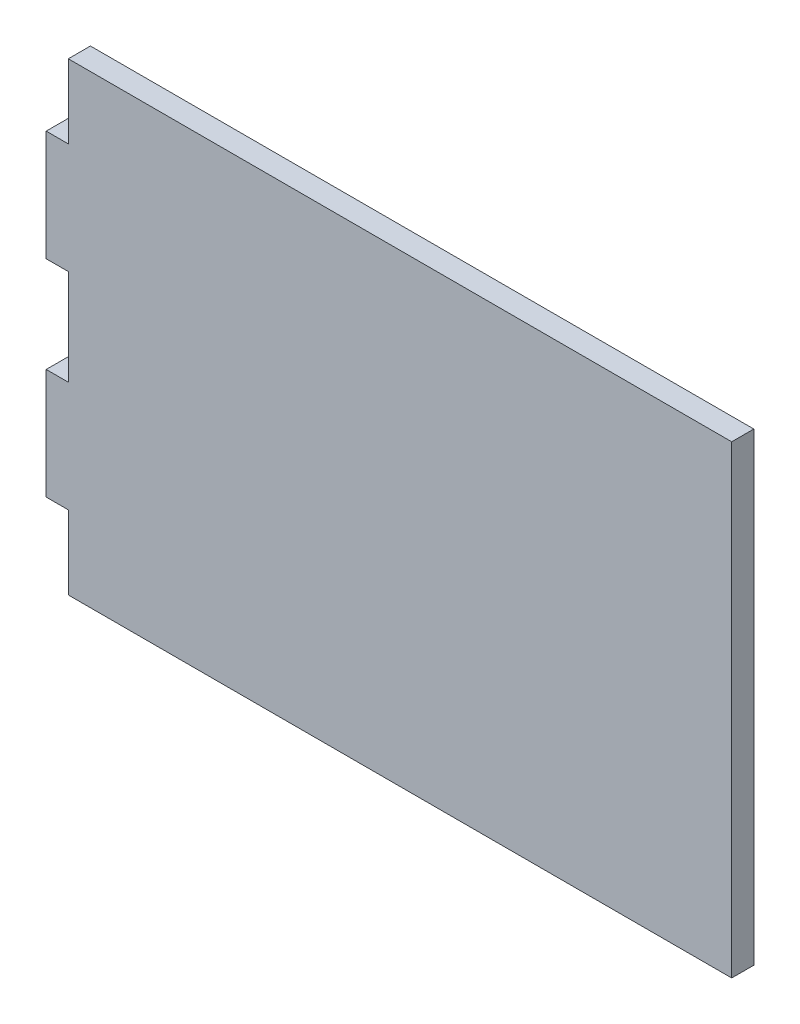
ISO-10303-21;
HEADER;
FILE_DESCRIPTION(('STEP AP214'),'2;1');
FILE_NAME('part.step','',(''),(''),'','','');
FILE_SCHEMA(('AUTOMOTIVE_DESIGN { 1 0 10303 214 1 1 1 1 }'));
ENDSEC;
DATA;
#1=APPLICATION_CONTEXT('core data for automotive mechanical design processes');
#2=APPLICATION_PROTOCOL_DEFINITION('international standard','automotive_design',2000,#1);
#3=PRODUCT_CONTEXT('',#1,'mechanical');
#4=PRODUCT('Part','Part','',(#3));
#5=PRODUCT_RELATED_PRODUCT_CATEGORY('part','',(#4));
#6=PRODUCT_DEFINITION_FORMATION('','',#4);
#7=PRODUCT_DEFINITION_CONTEXT('part definition',#1,'design');
#8=PRODUCT_DEFINITION('design','',#6,#7);
#9=PRODUCT_DEFINITION_SHAPE('','',#8);
#10=(LENGTH_UNIT() NAMED_UNIT(*) SI_UNIT(.MILLI.,.METRE.));
#11=(NAMED_UNIT(*) PLANE_ANGLE_UNIT() SI_UNIT($,.RADIAN.));
#12=(NAMED_UNIT(*) SI_UNIT($,.STERADIAN.) SOLID_ANGLE_UNIT());
#13=UNCERTAINTY_MEASURE_WITH_UNIT(LENGTH_MEASURE(1.E-05),#10,'distance_accuracy_value','');
#14=(GEOMETRIC_REPRESENTATION_CONTEXT(3) GLOBAL_UNCERTAINTY_ASSIGNED_CONTEXT((#13)) GLOBAL_UNIT_ASSIGNED_CONTEXT((#10,
#11,#12)) REPRESENTATION_CONTEXT('',''));
#15=CARTESIAN_POINT('',(0.,0.,0.));
#16=DIRECTION('',(0.,0.,1.));
#17=DIRECTION('',(1.,0.,0.));
#18=AXIS2_PLACEMENT_3D('',#15,#16,#17);
#19=CARTESIAN_POINT('',(0.,-31.5,1.5));
#20=DIRECTION('',(0.,1.,0.));
#21=DIRECTION('',(-1.,0.,0.));
#22=AXIS2_PLACEMENT_3D('',#19,#20,#21);
#23=PLANE('',#22);
#24=DIRECTION('',(1.,0.,0.));
#25=VECTOR('',#24,1.);
#26=CARTESIAN_POINT('',(0.,-31.5,-1.5));
#27=LINE('',#26,#25);
#28=CARTESIAN_POINT('',(-45.,-31.5,-1.5));
#29=VERTEX_POINT('',#28);
#30=CARTESIAN_POINT('',(45.,-31.5,-1.5));
#31=VERTEX_POINT('',#30);
#32=EDGE_CURVE('E159',#29,#31,#27,.T.);
#33=ORIENTED_EDGE('',*,*,#32,.T.);
#34=DIRECTION('',(0.,0.,-1.));
#35=VECTOR('',#34,1.);
#36=CARTESIAN_POINT('',(45.,-31.5,1.5));
#37=LINE('',#36,#35);
#38=CARTESIAN_POINT('',(45.,-31.5,1.5));
#39=VERTEX_POINT('',#38);
#40=EDGE_CURVE('E12',#39,#31,#37,.T.);
#41=ORIENTED_EDGE('',*,*,#40,.F.);
#42=DIRECTION('',(1.,0.,0.));
#43=VECTOR('',#42,1.);
#44=CARTESIAN_POINT('',(0.,-31.5,1.5));
#45=LINE('',#44,#43);
#46=CARTESIAN_POINT('',(-45.,-31.5,1.5));
#47=VERTEX_POINT('',#46);
#48=EDGE_CURVE('E193',#47,#39,#45,.T.);
#49=ORIENTED_EDGE('',*,*,#48,.F.);
#50=DIRECTION('',(0.,0.,-1.));
#51=VECTOR('',#50,1.);
#52=CARTESIAN_POINT('',(-45.,-31.5,1.5));
#53=LINE('',#52,#51);
#54=EDGE_CURVE('E51',#47,#29,#53,.T.);
#55=ORIENTED_EDGE('',*,*,#54,.T.);
#56=EDGE_LOOP('',(#33,#41,#49,#55));
#57=FACE_BOUND('',#56,.T.);
#58=ADVANCED_FACE('F35',(#57),#23,.F.);
#59=CARTESIAN_POINT('',(45.,0.,1.5));
#60=DIRECTION('',(-1.,0.,0.));
#61=DIRECTION('',(0.,0.,1.));
#62=AXIS2_PLACEMENT_3D('',#59,#60,#61);
#63=PLANE('',#62);
#64=DIRECTION('',(0.,1.,0.));
#65=VECTOR('',#64,1.);
#66=CARTESIAN_POINT('',(45.,0.,-1.5));
#67=LINE('',#66,#65);
#68=CARTESIAN_POINT('',(45.,31.5,-1.5));
#69=VERTEX_POINT('',#68);
#70=EDGE_CURVE('E216',#31,#69,#67,.T.);
#71=ORIENTED_EDGE('',*,*,#70,.T.);
#72=DIRECTION('',(0.,0.,-1.));
#73=VECTOR('',#72,1.);
#74=CARTESIAN_POINT('',(45.,31.5,1.5));
#75=LINE('',#74,#73);
#76=CARTESIAN_POINT('',(45.,31.5,1.5));
#77=VERTEX_POINT('',#76);
#78=EDGE_CURVE('E43',#77,#69,#75,.T.);
#79=ORIENTED_EDGE('',*,*,#78,.F.);
#80=DIRECTION('',(0.,1.,0.));
#81=VECTOR('',#80,1.);
#82=CARTESIAN_POINT('',(45.,0.,1.5));
#83=LINE('',#82,#81);
#84=EDGE_CURVE('E101',#39,#77,#83,.T.);
#85=ORIENTED_EDGE('',*,*,#84,.F.);
#86=ORIENTED_EDGE('',*,*,#40,.T.);
#87=EDGE_LOOP('',(#71,#79,#85,#86));
#88=FACE_BOUND('',#87,.T.);
#89=ADVANCED_FACE('F241',(#88),#63,.F.);
#90=CARTESIAN_POINT('',(0.,31.5,1.5));
#91=DIRECTION('',(0.,1.,0.));
#92=DIRECTION('',(-1.,0.,0.));
#93=AXIS2_PLACEMENT_3D('',#90,#91,#92);
#94=PLANE('',#93);
#95=DIRECTION('',(1.,0.,0.));
#96=VECTOR('',#95,1.);
#97=CARTESIAN_POINT('',(0.,31.5,-1.5));
#98=LINE('',#97,#96);
#99=CARTESIAN_POINT('',(-45.,31.5,-1.5));
#100=VERTEX_POINT('',#99);
#101=EDGE_CURVE('E211',#100,#69,#98,.T.);
#102=ORIENTED_EDGE('',*,*,#101,.F.);
#103=DIRECTION('',(0.,0.,-1.));
#104=VECTOR('',#103,1.);
#105=CARTESIAN_POINT('',(-45.,31.5,1.5));
#106=LINE('',#105,#104);
#107=CARTESIAN_POINT('',(-45.,31.5,1.5));
#108=VERTEX_POINT('',#107);
#109=EDGE_CURVE('E395',#108,#100,#106,.T.);
#110=ORIENTED_EDGE('',*,*,#109,.F.);
#111=DIRECTION('',(1.,0.,0.));
#112=VECTOR('',#111,1.);
#113=CARTESIAN_POINT('',(0.,31.5,1.5));
#114=LINE('',#113,#112);
#115=EDGE_CURVE('E183',#108,#77,#114,.T.);
#116=ORIENTED_EDGE('',*,*,#115,.T.);
#117=ORIENTED_EDGE('',*,*,#78,.T.);
#118=EDGE_LOOP('',(#102,#110,#116,#117));
#119=FACE_BOUND('',#118,.T.);
#120=ADVANCED_FACE('F234',(#119),#94,.T.);
#121=CARTESIAN_POINT('',(-45.,0.,1.5));
#122=DIRECTION('',(-1.,0.,0.));
#123=DIRECTION('',(0.,0.,1.));
#124=AXIS2_PLACEMENT_3D('',#121,#122,#123);
#125=PLANE('',#124);
#126=DIRECTION('',(0.,1.,0.));
#127=VECTOR('',#126,1.);
#128=CARTESIAN_POINT('',(-45.,0.,-1.5));
#129=LINE('',#128,#127);
#130=CARTESIAN_POINT('',(-45.,21.5,-1.5));
#131=VERTEX_POINT('',#130);
#132=EDGE_CURVE('E201',#131,#100,#129,.T.);
#133=ORIENTED_EDGE('',*,*,#132,.F.);
#134=DIRECTION('',(0.,0.,-1.));
#135=VECTOR('',#134,1.);
#136=CARTESIAN_POINT('',(-45.,21.5,1.5));
#137=LINE('',#136,#135);
#138=CARTESIAN_POINT('',(-45.,21.5,1.5));
#139=VERTEX_POINT('',#138);
#140=EDGE_CURVE('E393',#139,#131,#137,.T.);
#141=ORIENTED_EDGE('',*,*,#140,.F.);
#142=DIRECTION('',(0.,1.,0.));
#143=VECTOR('',#142,1.);
#144=CARTESIAN_POINT('',(-45.,0.,1.5));
#145=LINE('',#144,#143);
#146=EDGE_CURVE('E154',#139,#108,#145,.T.);
#147=ORIENTED_EDGE('',*,*,#146,.T.);
#148=ORIENTED_EDGE('',*,*,#109,.T.);
#149=EDGE_LOOP('',(#133,#141,#147,#148));
#150=FACE_BOUND('',#149,.T.);
#151=ADVANCED_FACE('F223',(#150),#125,.T.);
#152=CARTESIAN_POINT('',(0.,21.5000000000001,1.5));
#153=DIRECTION('',(0.,-1.,0.));
#154=DIRECTION('',(1.,0.,0.));
#155=AXIS2_PLACEMENT_3D('',#152,#153,#154);
#156=PLANE('',#155);
#157=DIRECTION('',(-1.,0.,0.));
#158=VECTOR('',#157,1.);
#159=CARTESIAN_POINT('',(0.,21.5000000000001,-1.5));
#160=LINE('',#159,#158);
#161=CARTESIAN_POINT('',(-48.,21.5,-1.5));
#162=VERTEX_POINT('',#161);
#163=EDGE_CURVE('E210',#131,#162,#160,.T.);
#164=ORIENTED_EDGE('',*,*,#163,.T.);
#165=DIRECTION('',(0.,0.,-1.));
#166=VECTOR('',#165,1.);
#167=CARTESIAN_POINT('',(-48.,21.5,1.5));
#168=LINE('',#167,#166);
#169=CARTESIAN_POINT('',(-48.,21.5,1.5));
#170=VERTEX_POINT('',#169);
#171=EDGE_CURVE('E390',#170,#162,#168,.T.);
#172=ORIENTED_EDGE('',*,*,#171,.F.);
#173=DIRECTION('',(-1.,0.,0.));
#174=VECTOR('',#173,1.);
#175=CARTESIAN_POINT('',(0.,21.5000000000001,1.5));
#176=LINE('',#175,#174);
#177=EDGE_CURVE('E178',#139,#170,#176,.T.);
#178=ORIENTED_EDGE('',*,*,#177,.F.);
#179=ORIENTED_EDGE('',*,*,#140,.T.);
#180=EDGE_LOOP('',(#164,#172,#178,#179));
#181=FACE_BOUND('',#180,.T.);
#182=ADVANCED_FACE('F233',(#181),#156,.F.);
#183=CARTESIAN_POINT('',(-48.,0.,1.5));
#184=DIRECTION('',(1.,0.,0.));
#185=DIRECTION('',(0.,0.,-1.));
#186=AXIS2_PLACEMENT_3D('',#183,#184,#185);
#187=PLANE('',#186);
#188=DIRECTION('',(0.,-1.,0.));
#189=VECTOR('',#188,1.);
#190=CARTESIAN_POINT('',(-48.,0.,-1.5));
#191=LINE('',#190,#189);
#192=CARTESIAN_POINT('',(-48.,6.5,-1.5));
#193=VERTEX_POINT('',#192);
#194=EDGE_CURVE('E215',#162,#193,#191,.T.);
#195=ORIENTED_EDGE('',*,*,#194,.T.);
#196=DIRECTION('',(0.,0.,-1.));
#197=VECTOR('',#196,1.);
#198=CARTESIAN_POINT('',(-48.,6.5,1.5));
#199=LINE('',#198,#197);
#200=CARTESIAN_POINT('',(-48.,6.5,1.5));
#201=VERTEX_POINT('',#200);
#202=EDGE_CURVE('E388',#201,#193,#199,.T.);
#203=ORIENTED_EDGE('',*,*,#202,.F.);
#204=DIRECTION('',(0.,-1.,0.));
#205=VECTOR('',#204,1.);
#206=CARTESIAN_POINT('',(-48.,0.,1.5));
#207=LINE('',#206,#205);
#208=EDGE_CURVE('E171',#170,#201,#207,.T.);
#209=ORIENTED_EDGE('',*,*,#208,.F.);
#210=ORIENTED_EDGE('',*,*,#171,.T.);
#211=EDGE_LOOP('',(#195,#203,#209,#210));
#212=FACE_BOUND('',#211,.T.);
#213=ADVANCED_FACE('F253',(#212),#187,.F.);
#214=CARTESIAN_POINT('',(0.,6.49999999999997,1.5));
#215=DIRECTION('',(0.,-1.,0.));
#216=DIRECTION('',(1.,0.,0.));
#217=AXIS2_PLACEMENT_3D('',#214,#215,#216);
#218=PLANE('',#217);
#219=DIRECTION('',(-1.,0.,0.));
#220=VECTOR('',#219,1.);
#221=CARTESIAN_POINT('',(0.,6.49999999999997,-1.5));
#222=LINE('',#221,#220);
#223=CARTESIAN_POINT('',(-45.,6.5,-1.5));
#224=VERTEX_POINT('',#223);
#225=EDGE_CURVE('E208',#224,#193,#222,.T.);
#226=ORIENTED_EDGE('',*,*,#225,.F.);
#227=DIRECTION('',(0.,0.,-1.));
#228=VECTOR('',#227,1.);
#229=CARTESIAN_POINT('',(-45.,6.5,1.5));
#230=LINE('',#229,#228);
#231=CARTESIAN_POINT('',(-45.,6.5,1.5));
#232=VERTEX_POINT('',#231);
#233=EDGE_CURVE('E386',#232,#224,#230,.T.);
#234=ORIENTED_EDGE('',*,*,#233,.F.);
#235=DIRECTION('',(-1.,0.,0.));
#236=VECTOR('',#235,1.);
#237=CARTESIAN_POINT('',(0.,6.49999999999997,1.5));
#238=LINE('',#237,#236);
#239=EDGE_CURVE('E167',#232,#201,#238,.T.);
#240=ORIENTED_EDGE('',*,*,#239,.T.);
#241=ORIENTED_EDGE('',*,*,#202,.T.);
#242=EDGE_LOOP('',(#226,#234,#240,#241));
#243=FACE_BOUND('',#242,.T.);
#244=ADVANCED_FACE('F238',(#243),#218,.T.);
#245=CARTESIAN_POINT('',(-45.,-6.5,-1.5));
#246=VERTEX_POINT('',#245);
#247=EDGE_CURVE('E200',#246,#224,#129,.T.);
#248=ORIENTED_EDGE('',*,*,#247,.F.);
#249=DIRECTION('',(0.,0.,-1.));
#250=VECTOR('',#249,1.);
#251=CARTESIAN_POINT('',(-45.,-6.5,1.5));
#252=LINE('',#251,#250);
#253=CARTESIAN_POINT('',(-45.,-6.5,1.5));
#254=VERTEX_POINT('',#253);
#255=EDGE_CURVE('E376',#254,#246,#252,.T.);
#256=ORIENTED_EDGE('',*,*,#255,.F.);
#257=EDGE_CURVE('E153',#254,#232,#145,.T.);
#258=ORIENTED_EDGE('',*,*,#257,.T.);
#259=ORIENTED_EDGE('',*,*,#233,.T.);
#260=EDGE_LOOP('',(#248,#256,#258,#259));
#261=FACE_BOUND('',#260,.T.);
#262=ADVANCED_FACE('F224',(#261),#125,.T.);
#263=CARTESIAN_POINT('',(0.,-6.49999999999997,1.5));
#264=DIRECTION('',(0.,-1.,0.));
#265=DIRECTION('',(1.,0.,0.));
#266=AXIS2_PLACEMENT_3D('',#263,#264,#265);
#267=PLANE('',#266);
#268=DIRECTION('',(-1.,0.,0.));
#269=VECTOR('',#268,1.);
#270=CARTESIAN_POINT('',(0.,-6.49999999999997,-1.5));
#271=LINE('',#270,#269);
#272=CARTESIAN_POINT('',(-48.,-6.5,-1.5));
#273=VERTEX_POINT('',#272);
#274=EDGE_CURVE('E207',#246,#273,#271,.T.);
#275=ORIENTED_EDGE('',*,*,#274,.T.);
#276=DIRECTION('',(0.,0.,-1.));
#277=VECTOR('',#276,1.);
#278=CARTESIAN_POINT('',(-48.,-6.5,1.5));
#279=LINE('',#278,#277);
#280=CARTESIAN_POINT('',(-48.,-6.5,1.5));
#281=VERTEX_POINT('',#280);
#282=EDGE_CURVE('E138',#281,#273,#279,.T.);
#283=ORIENTED_EDGE('',*,*,#282,.F.);
#284=DIRECTION('',(-1.,0.,0.));
#285=VECTOR('',#284,1.);
#286=CARTESIAN_POINT('',(0.,-6.49999999999997,1.5));
#287=LINE('',#286,#285);
#288=EDGE_CURVE('E147',#254,#281,#287,.T.);
#289=ORIENTED_EDGE('',*,*,#288,.F.);
#290=ORIENTED_EDGE('',*,*,#255,.T.);
#291=EDGE_LOOP('',(#275,#283,#289,#290));
#292=FACE_BOUND('',#291,.T.);
#293=ADVANCED_FACE('F237',(#292),#267,.F.);
#294=CARTESIAN_POINT('',(-48.,0.,1.5));
#295=DIRECTION('',(-1.,0.,0.));
#296=DIRECTION('',(0.,0.,1.));
#297=AXIS2_PLACEMENT_3D('',#294,#295,#296);
#298=PLANE('',#297);
#299=DIRECTION('',(0.,1.,0.));
#300=VECTOR('',#299,1.);
#301=CARTESIAN_POINT('',(-48.,0.,-1.5));
#302=LINE('',#301,#300);
#303=CARTESIAN_POINT('',(-48.,-21.5,-1.5));
#304=VERTEX_POINT('',#303);
#305=EDGE_CURVE('E134',#304,#273,#302,.T.);
#306=ORIENTED_EDGE('',*,*,#305,.F.);
#307=DIRECTION('',(0.,0.,-1.));
#308=VECTOR('',#307,1.);
#309=CARTESIAN_POINT('',(-48.,-21.5,1.5));
#310=LINE('',#309,#308);
#311=CARTESIAN_POINT('',(-48.,-21.5,1.5));
#312=VERTEX_POINT('',#311);
#313=EDGE_CURVE('E129',#312,#304,#310,.T.);
#314=ORIENTED_EDGE('',*,*,#313,.F.);
#315=DIRECTION('',(0.,1.,0.));
#316=VECTOR('',#315,1.);
#317=CARTESIAN_POINT('',(-48.,0.,1.5));
#318=LINE('',#317,#316);
#319=EDGE_CURVE('E132',#312,#281,#318,.T.);
#320=ORIENTED_EDGE('',*,*,#319,.T.);
#321=ORIENTED_EDGE('',*,*,#282,.T.);
#322=EDGE_LOOP('',(#306,#314,#320,#321));
#323=FACE_BOUND('',#322,.T.);
#324=ADVANCED_FACE('F131',(#323),#298,.T.);
#325=CARTESIAN_POINT('',(0.,-21.5000000000001,1.5));
#326=DIRECTION('',(0.,-1.,0.));
#327=DIRECTION('',(1.,0.,0.));
#328=AXIS2_PLACEMENT_3D('',#325,#326,#327);
#329=PLANE('',#328);
#330=DIRECTION('',(-1.,0.,0.));
#331=VECTOR('',#330,1.);
#332=CARTESIAN_POINT('',(0.,-21.5000000000001,-1.5));
#333=LINE('',#332,#331);
#334=CARTESIAN_POINT('',(-45.,-21.5,-1.5));
#335=VERTEX_POINT('',#334);
#336=EDGE_CURVE('E198',#335,#304,#333,.T.);
#337=ORIENTED_EDGE('',*,*,#336,.F.);
#338=DIRECTION('',(0.,0.,-1.));
#339=VECTOR('',#338,1.);
#340=CARTESIAN_POINT('',(-45.,-21.5,1.5));
#341=LINE('',#340,#339);
#342=CARTESIAN_POINT('',(-45.,-21.5,1.5));
#343=VERTEX_POINT('',#342);
#344=EDGE_CURVE('E89',#343,#335,#341,.T.);
#345=ORIENTED_EDGE('',*,*,#344,.F.);
#346=DIRECTION('',(-1.,0.,0.));
#347=VECTOR('',#346,1.);
#348=CARTESIAN_POINT('',(0.,-21.5000000000001,1.5));
#349=LINE('',#348,#347);
#350=EDGE_CURVE('E144',#343,#312,#349,.T.);
#351=ORIENTED_EDGE('',*,*,#350,.T.);
#352=ORIENTED_EDGE('',*,*,#313,.T.);
#353=EDGE_LOOP('',(#337,#345,#351,#352));
#354=FACE_BOUND('',#353,.T.);
#355=ADVANCED_FACE('F150',(#354),#329,.T.);
#356=EDGE_CURVE('E195',#29,#335,#129,.T.);
#357=ORIENTED_EDGE('',*,*,#356,.F.);
#358=ORIENTED_EDGE('',*,*,#54,.F.);
#359=EDGE_CURVE('E151',#47,#343,#145,.T.);
#360=ORIENTED_EDGE('',*,*,#359,.T.);
#361=ORIENTED_EDGE('',*,*,#344,.T.);
#362=EDGE_LOOP('',(#357,#358,#360,#361));
#363=FACE_BOUND('',#362,.T.);
#364=ADVANCED_FACE('F220',(#363),#125,.T.);
#365=CARTESIAN_POINT('',(0.,0.,1.5));
#366=DIRECTION('',(0.,0.,1.));
#367=DIRECTION('',(1.,0.,0.));
#368=AXIS2_PLACEMENT_3D('',#365,#366,#367);
#369=PLANE('',#368);
#370=ORIENTED_EDGE('',*,*,#48,.T.);
#371=ORIENTED_EDGE('',*,*,#84,.T.);
#372=ORIENTED_EDGE('',*,*,#115,.F.);
#373=ORIENTED_EDGE('',*,*,#146,.F.);
#374=ORIENTED_EDGE('',*,*,#177,.T.);
#375=ORIENTED_EDGE('',*,*,#208,.T.);
#376=ORIENTED_EDGE('',*,*,#239,.F.);
#377=ORIENTED_EDGE('',*,*,#257,.F.);
#378=ORIENTED_EDGE('',*,*,#288,.T.);
#379=ORIENTED_EDGE('',*,*,#319,.F.);
#380=ORIENTED_EDGE('',*,*,#350,.F.);
#381=ORIENTED_EDGE('',*,*,#359,.F.);
#382=EDGE_LOOP('',(#370,#371,#372,#373,#374,#375,#376,#377,#378,#379,#380,#381));
#383=FACE_BOUND('',#382,.T.);
#384=ADVANCED_FACE('F142',(#383),#369,.T.);
#385=CARTESIAN_POINT('',(0.,0.,-1.5));
#386=DIRECTION('',(0.,0.,1.));
#387=DIRECTION('',(1.,0.,0.));
#388=AXIS2_PLACEMENT_3D('',#385,#386,#387);
#389=PLANE('',#388);
#390=ORIENTED_EDGE('',*,*,#32,.F.);
#391=ORIENTED_EDGE('',*,*,#356,.T.);
#392=ORIENTED_EDGE('',*,*,#336,.T.);
#393=ORIENTED_EDGE('',*,*,#305,.T.);
#394=ORIENTED_EDGE('',*,*,#274,.F.);
#395=ORIENTED_EDGE('',*,*,#247,.T.);
#396=ORIENTED_EDGE('',*,*,#225,.T.);
#397=ORIENTED_EDGE('',*,*,#194,.F.);
#398=ORIENTED_EDGE('',*,*,#163,.F.);
#399=ORIENTED_EDGE('',*,*,#132,.T.);
#400=ORIENTED_EDGE('',*,*,#101,.T.);
#401=ORIENTED_EDGE('',*,*,#70,.F.);
#402=EDGE_LOOP('',(#390,#391,#392,#393,#394,#395,#396,#397,#398,#399,#400,#401));
#403=FACE_BOUND('',#402,.T.);
#404=ADVANCED_FACE('F219',(#403),#389,.F.);
#405=CLOSED_SHELL('',(#58,#89,#120,#151,#182,#213,#244,#262,#293,#324,#355,#364,#384,#404));
#406=MANIFOLD_SOLID_BREP('B2',#405);
#407=ADVANCED_BREP_SHAPE_REPRESENTATION('',(#18,#406),#14);
#408=SHAPE_DEFINITION_REPRESENTATION(#9,#407);
ENDSEC;
END-ISO-10303-21;
